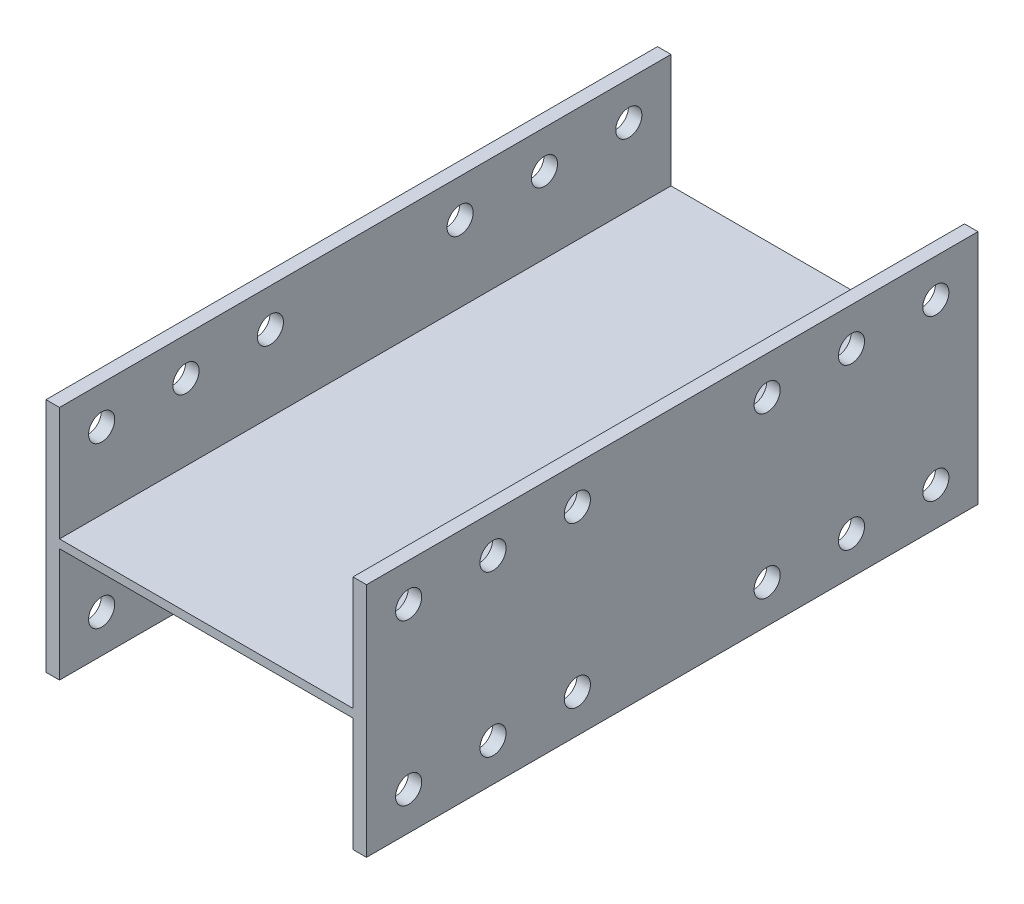
ISO-10303-21;
HEADER;
FILE_DESCRIPTION(('STEP AP214'),'2;1');
FILE_NAME('part.step','',(''),(''),'','','');
FILE_SCHEMA(('AUTOMOTIVE_DESIGN { 1 0 10303 214 1 1 1 1 }'));
ENDSEC;
DATA;
#1=APPLICATION_CONTEXT('core data for automotive mechanical design processes');
#2=APPLICATION_PROTOCOL_DEFINITION('international standard','automotive_design',2000,#1);
#3=PRODUCT_CONTEXT('',#1,'mechanical');
#4=PRODUCT('Part','Part','',(#3));
#5=PRODUCT_RELATED_PRODUCT_CATEGORY('part','',(#4));
#6=PRODUCT_DEFINITION_FORMATION('','',#4);
#7=PRODUCT_DEFINITION_CONTEXT('part definition',#1,'design');
#8=PRODUCT_DEFINITION('design','',#6,#7);
#9=PRODUCT_DEFINITION_SHAPE('','',#8);
#10=(LENGTH_UNIT() NAMED_UNIT(*) SI_UNIT(.MILLI.,.METRE.));
#11=(NAMED_UNIT(*) PLANE_ANGLE_UNIT() SI_UNIT($,.RADIAN.));
#12=(NAMED_UNIT(*) SI_UNIT($,.STERADIAN.) SOLID_ANGLE_UNIT());
#13=UNCERTAINTY_MEASURE_WITH_UNIT(LENGTH_MEASURE(1.E-05),#10,'distance_accuracy_value','');
#14=(GEOMETRIC_REPRESENTATION_CONTEXT(3) GLOBAL_UNCERTAINTY_ASSIGNED_CONTEXT((#13)) GLOBAL_UNIT_ASSIGNED_CONTEXT((#10,
#11,#12)) REPRESENTATION_CONTEXT('',''));
#15=CARTESIAN_POINT('',(0.,0.,0.));
#16=DIRECTION('',(0.,0.,1.));
#17=DIRECTION('',(1.,0.,0.));
#18=AXIS2_PLACEMENT_3D('',#15,#16,#17);
#19=CARTESIAN_POINT('',(174.,-5.,362.5));
#20=DIRECTION('',(0.,1.,0.));
#21=DIRECTION('',(0.,0.,1.));
#22=AXIS2_PLACEMENT_3D('',#19,#20,#21);
#23=PLANE('',#22);
#24=DIRECTION('',(1.,0.,0.));
#25=VECTOR('',#24,1.);
#26=CARTESIAN_POINT('',(174.,-5.,-362.5));
#27=LINE('',#26,#25);
#28=CARTESIAN_POINT('',(-174.,-5.,-362.5));
#29=VERTEX_POINT('',#28);
#30=CARTESIAN_POINT('',(174.,-5.,-362.5));
#31=VERTEX_POINT('',#30);
#32=EDGE_CURVE('E154',#29,#31,#27,.T.);
#33=ORIENTED_EDGE('',*,*,#32,.T.);
#34=DIRECTION('',(0.,0.,-1.));
#35=VECTOR('',#34,1.);
#36=CARTESIAN_POINT('',(174.,-5.,362.5));
#37=LINE('',#36,#35);
#38=CARTESIAN_POINT('',(174.,-5.,362.5));
#39=VERTEX_POINT('',#38);
#40=EDGE_CURVE('E11',#39,#31,#37,.T.);
#41=ORIENTED_EDGE('',*,*,#40,.F.);
#42=DIRECTION('',(1.,0.,0.));
#43=VECTOR('',#42,1.);
#44=CARTESIAN_POINT('',(174.,-5.,362.5));
#45=LINE('',#44,#43);
#46=CARTESIAN_POINT('',(-174.,-5.,362.5));
#47=VERTEX_POINT('',#46);
#48=EDGE_CURVE('E177',#47,#39,#45,.T.);
#49=ORIENTED_EDGE('',*,*,#48,.F.);
#50=DIRECTION('',(0.,0.,-1.));
#51=VECTOR('',#50,1.);
#52=CARTESIAN_POINT('',(-174.,-5.,362.5));
#53=LINE('',#52,#51);
#54=EDGE_CURVE('E150',#47,#29,#53,.T.);
#55=ORIENTED_EDGE('',*,*,#54,.T.);
#56=EDGE_LOOP('',(#33,#41,#49,#55));
#57=FACE_BOUND('',#56,.T.);
#58=ADVANCED_FACE('F32',(#57),#23,.F.);
#59=CARTESIAN_POINT('',(174.,-5.,362.5));
#60=DIRECTION('',(1.,0.,0.));
#61=DIRECTION('',(0.,1.,0.));
#62=AXIS2_PLACEMENT_3D('',#59,#60,#61);
#63=PLANE('',#62);
#64=CARTESIAN_POINT('',(174.,-95.,-112.5));
#65=DIRECTION('',(1.,0.,0.));
#66=DIRECTION('',(0.,1.,0.));
#67=AXIS2_PLACEMENT_3D('',#64,#65,#66);
#68=CIRCLE('',#67,15.5);
#69=CARTESIAN_POINT('',(174.,-79.5,-112.5));
#70=VERTEX_POINT('',#69);
#71=EDGE_CURVE('E235',#70,#70,#68,.T.);
#72=ORIENTED_EDGE('',*,*,#71,.T.);
#73=EDGE_LOOP('',(#72));
#74=FACE_BOUND('',#73,.T.);
#75=CARTESIAN_POINT('',(174.,-95.,-212.5));
#76=DIRECTION('',(1.,0.,0.));
#77=DIRECTION('',(0.,1.,0.));
#78=AXIS2_PLACEMENT_3D('',#75,#76,#77);
#79=CIRCLE('',#78,15.5);
#80=CARTESIAN_POINT('',(174.,-79.5,-212.5));
#81=VERTEX_POINT('',#80);
#82=EDGE_CURVE('E222',#81,#81,#79,.T.);
#83=ORIENTED_EDGE('',*,*,#82,.T.);
#84=EDGE_LOOP('',(#83));
#85=FACE_BOUND('',#84,.T.);
#86=CARTESIAN_POINT('',(174.,-95.,-312.5));
#87=DIRECTION('',(1.,0.,0.));
#88=DIRECTION('',(0.,1.,0.));
#89=AXIS2_PLACEMENT_3D('',#86,#87,#88);
#90=CIRCLE('',#89,15.5);
#91=CARTESIAN_POINT('',(174.,-79.5,-312.5));
#92=VERTEX_POINT('',#91);
#93=EDGE_CURVE('E218',#92,#92,#90,.T.);
#94=ORIENTED_EDGE('',*,*,#93,.T.);
#95=EDGE_LOOP('',(#94));
#96=FACE_BOUND('',#95,.T.);
#97=CARTESIAN_POINT('',(174.,-95.,312.5));
#98=DIRECTION('',(1.,0.,0.));
#99=DIRECTION('',(0.,1.,0.));
#100=AXIS2_PLACEMENT_3D('',#97,#98,#99);
#101=CIRCLE('',#100,15.5);
#102=CARTESIAN_POINT('',(174.,-79.5,312.5));
#103=VERTEX_POINT('',#102);
#104=EDGE_CURVE('E214',#103,#103,#101,.T.);
#105=ORIENTED_EDGE('',*,*,#104,.T.);
#106=EDGE_LOOP('',(#105));
#107=FACE_BOUND('',#106,.T.);
#108=CARTESIAN_POINT('',(174.,-95.,212.5));
#109=DIRECTION('',(1.,0.,0.));
#110=DIRECTION('',(0.,1.,0.));
#111=AXIS2_PLACEMENT_3D('',#108,#109,#110);
#112=CIRCLE('',#111,15.5);
#113=CARTESIAN_POINT('',(174.,-79.5,212.5));
#114=VERTEX_POINT('',#113);
#115=EDGE_CURVE('E209',#114,#114,#112,.T.);
#116=ORIENTED_EDGE('',*,*,#115,.T.);
#117=EDGE_LOOP('',(#116));
#118=FACE_BOUND('',#117,.T.);
#119=CARTESIAN_POINT('',(174.,-95.,112.5));
#120=DIRECTION('',(1.,0.,0.));
#121=DIRECTION('',(0.,1.,0.));
#122=AXIS2_PLACEMENT_3D('',#119,#120,#121);
#123=CIRCLE('',#122,15.5);
#124=CARTESIAN_POINT('',(174.,-79.5,112.5));
#125=VERTEX_POINT('',#124);
#126=EDGE_CURVE('E204',#125,#125,#123,.T.);
#127=ORIENTED_EDGE('',*,*,#126,.T.);
#128=EDGE_LOOP('',(#127));
#129=FACE_BOUND('',#128,.T.);
#130=DIRECTION('',(0.,-1.,0.));
#131=VECTOR('',#130,1.);
#132=CARTESIAN_POINT('',(174.,-5.,-362.5));
#133=LINE('',#132,#131);
#134=CARTESIAN_POINT('',(174.,-140.,-362.5));
#135=VERTEX_POINT('',#134);
#136=EDGE_CURVE('E157',#31,#135,#133,.T.);
#137=ORIENTED_EDGE('',*,*,#136,.T.);
#138=DIRECTION('',(0.,0.,-1.));
#139=VECTOR('',#138,1.);
#140=CARTESIAN_POINT('',(174.,-140.,362.5));
#141=LINE('',#140,#139);
#142=CARTESIAN_POINT('',(174.,-140.,362.5));
#143=VERTEX_POINT('',#142);
#144=EDGE_CURVE('E41',#143,#135,#141,.T.);
#145=ORIENTED_EDGE('',*,*,#144,.F.);
#146=DIRECTION('',(0.,-1.,0.));
#147=VECTOR('',#146,1.);
#148=CARTESIAN_POINT('',(174.,-5.,362.5));
#149=LINE('',#148,#147);
#150=EDGE_CURVE('E105',#39,#143,#149,.T.);
#151=ORIENTED_EDGE('',*,*,#150,.F.);
#152=ORIENTED_EDGE('',*,*,#40,.T.);
#153=EDGE_LOOP('',(#137,#145,#151,#152));
#154=FACE_BOUND('',#153,.T.);
#155=ADVANCED_FACE('F344',(#74,#85,#96,#107,#118,#129,#154),#63,.F.);
#156=CARTESIAN_POINT('',(174.,-140.,362.5));
#157=DIRECTION('',(0.,1.,0.));
#158=DIRECTION('',(0.,0.,1.));
#159=AXIS2_PLACEMENT_3D('',#156,#157,#158);
#160=PLANE('',#159);
#161=DIRECTION('',(1.,0.,0.));
#162=VECTOR('',#161,1.);
#163=CARTESIAN_POINT('',(174.,-140.,-362.5));
#164=LINE('',#163,#162);
#165=CARTESIAN_POINT('',(190.,-140.,-362.5));
#166=VERTEX_POINT('',#165);
#167=EDGE_CURVE('E160',#135,#166,#164,.T.);
#168=ORIENTED_EDGE('',*,*,#167,.T.);
#169=DIRECTION('',(0.,0.,-1.));
#170=VECTOR('',#169,1.);
#171=CARTESIAN_POINT('',(190.,-140.,362.5));
#172=LINE('',#171,#170);
#173=CARTESIAN_POINT('',(190.,-140.,362.5));
#174=VERTEX_POINT('',#173);
#175=EDGE_CURVE('E196',#174,#166,#172,.T.);
#176=ORIENTED_EDGE('',*,*,#175,.F.);
#177=DIRECTION('',(1.,0.,0.));
#178=VECTOR('',#177,1.);
#179=CARTESIAN_POINT('',(174.,-140.,362.5));
#180=LINE('',#179,#178);
#181=EDGE_CURVE('E303',#143,#174,#180,.T.);
#182=ORIENTED_EDGE('',*,*,#181,.F.);
#183=ORIENTED_EDGE('',*,*,#144,.T.);
#184=EDGE_LOOP('',(#168,#176,#182,#183));
#185=FACE_BOUND('',#184,.T.);
#186=ADVANCED_FACE('F348',(#185),#160,.F.);
#187=CARTESIAN_POINT('',(190.,-140.,362.5));
#188=DIRECTION('',(-1.,0.,0.));
#189=DIRECTION('',(0.,-1.,0.));
#190=AXIS2_PLACEMENT_3D('',#187,#188,#189);
#191=PLANE('',#190);
#192=CARTESIAN_POINT('',(190.,95.,-312.5));
#193=DIRECTION('',(1.,0.,0.));
#194=DIRECTION('',(0.,0.,1.));
#195=AXIS2_PLACEMENT_3D('',#192,#193,#194);
#196=CIRCLE('',#195,15.5);
#197=CARTESIAN_POINT('',(190.,95.,-297.));
#198=VERTEX_POINT('',#197);
#199=EDGE_CURVE('E487',#198,#198,#196,.T.);
#200=ORIENTED_EDGE('',*,*,#199,.F.);
#201=EDGE_LOOP('',(#200));
#202=FACE_BOUND('',#201,.T.);
#203=CARTESIAN_POINT('',(190.,95.,-212.5));
#204=DIRECTION('',(1.,0.,0.));
#205=DIRECTION('',(0.,0.,1.));
#206=AXIS2_PLACEMENT_3D('',#203,#204,#205);
#207=CIRCLE('',#206,15.5);
#208=CARTESIAN_POINT('',(190.,95.,-197.));
#209=VERTEX_POINT('',#208);
#210=EDGE_CURVE('E491',#209,#209,#207,.T.);
#211=ORIENTED_EDGE('',*,*,#210,.F.);
#212=EDGE_LOOP('',(#211));
#213=FACE_BOUND('',#212,.T.);
#214=CARTESIAN_POINT('',(190.,95.,-112.5));
#215=DIRECTION('',(1.,0.,0.));
#216=DIRECTION('',(0.,0.,1.));
#217=AXIS2_PLACEMENT_3D('',#214,#215,#216);
#218=CIRCLE('',#217,15.5);
#219=CARTESIAN_POINT('',(190.,95.,-97.));
#220=VERTEX_POINT('',#219);
#221=EDGE_CURVE('E507',#220,#220,#218,.T.);
#222=ORIENTED_EDGE('',*,*,#221,.F.);
#223=EDGE_LOOP('',(#222));
#224=FACE_BOUND('',#223,.T.);
#225=CARTESIAN_POINT('',(190.,-95.,-112.5));
#226=DIRECTION('',(1.,0.,0.));
#227=DIRECTION('',(0.,0.,-1.));
#228=AXIS2_PLACEMENT_3D('',#225,#226,#227);
#229=CIRCLE('',#228,15.5);
#230=CARTESIAN_POINT('',(190.,-95.,-128.));
#231=VERTEX_POINT('',#230);
#232=EDGE_CURVE('E517',#231,#231,#229,.T.);
#233=ORIENTED_EDGE('',*,*,#232,.F.);
#234=EDGE_LOOP('',(#233));
#235=FACE_BOUND('',#234,.T.);
#236=CARTESIAN_POINT('',(190.,-95.,-212.5));
#237=DIRECTION('',(1.,0.,0.));
#238=DIRECTION('',(0.,0.,-1.));
#239=AXIS2_PLACEMENT_3D('',#236,#237,#238);
#240=CIRCLE('',#239,15.5);
#241=CARTESIAN_POINT('',(190.,-95.,-228.));
#242=VERTEX_POINT('',#241);
#243=EDGE_CURVE('E230',#242,#242,#240,.T.);
#244=ORIENTED_EDGE('',*,*,#243,.F.);
#245=EDGE_LOOP('',(#244));
#246=FACE_BOUND('',#245,.T.);
#247=CARTESIAN_POINT('',(190.,-95.,-312.5));
#248=DIRECTION('',(1.,0.,0.));
#249=DIRECTION('',(0.,0.,-1.));
#250=AXIS2_PLACEMENT_3D('',#247,#248,#249);
#251=CIRCLE('',#250,15.5);
#252=CARTESIAN_POINT('',(190.,-95.,-328.));
#253=VERTEX_POINT('',#252);
#254=EDGE_CURVE('E227',#253,#253,#251,.T.);
#255=ORIENTED_EDGE('',*,*,#254,.F.);
#256=EDGE_LOOP('',(#255));
#257=FACE_BOUND('',#256,.T.);
#258=CARTESIAN_POINT('',(190.,-95.,312.5));
#259=DIRECTION('',(1.,0.,0.));
#260=DIRECTION('',(0.,0.,1.));
#261=AXIS2_PLACEMENT_3D('',#258,#259,#260);
#262=CIRCLE('',#261,15.5);
#263=CARTESIAN_POINT('',(190.,-95.,328.));
#264=VERTEX_POINT('',#263);
#265=EDGE_CURVE('E245',#264,#264,#262,.T.);
#266=ORIENTED_EDGE('',*,*,#265,.F.);
#267=EDGE_LOOP('',(#266));
#268=FACE_BOUND('',#267,.T.);
#269=CARTESIAN_POINT('',(190.,-95.,212.5));
#270=DIRECTION('',(1.,0.,0.));
#271=DIRECTION('',(0.,0.,1.));
#272=AXIS2_PLACEMENT_3D('',#269,#270,#271);
#273=CIRCLE('',#272,15.5);
#274=CARTESIAN_POINT('',(190.,-95.,228.));
#275=VERTEX_POINT('',#274);
#276=EDGE_CURVE('E252',#275,#275,#273,.T.);
#277=ORIENTED_EDGE('',*,*,#276,.F.);
#278=EDGE_LOOP('',(#277));
#279=FACE_BOUND('',#278,.T.);
#280=CARTESIAN_POINT('',(190.,95.,112.5));
#281=DIRECTION('',(1.,0.,0.));
#282=DIRECTION('',(0.,0.,-1.));
#283=AXIS2_PLACEMENT_3D('',#280,#281,#282);
#284=CIRCLE('',#283,15.5);
#285=CARTESIAN_POINT('',(190.,95.,97.));
#286=VERTEX_POINT('',#285);
#287=EDGE_CURVE('E259',#286,#286,#284,.T.);
#288=ORIENTED_EDGE('',*,*,#287,.F.);
#289=EDGE_LOOP('',(#288));
#290=FACE_BOUND('',#289,.T.);
#291=CARTESIAN_POINT('',(190.,95.,212.5));
#292=DIRECTION('',(1.,0.,0.));
#293=DIRECTION('',(0.,0.,-1.));
#294=AXIS2_PLACEMENT_3D('',#291,#292,#293);
#295=CIRCLE('',#294,15.5);
#296=CARTESIAN_POINT('',(190.,95.,197.));
#297=VERTEX_POINT('',#296);
#298=EDGE_CURVE('E271',#297,#297,#295,.T.);
#299=ORIENTED_EDGE('',*,*,#298,.F.);
#300=EDGE_LOOP('',(#299));
#301=FACE_BOUND('',#300,.T.);
#302=CARTESIAN_POINT('',(190.,-95.,112.5));
#303=DIRECTION('',(1.,0.,0.));
#304=DIRECTION('',(0.,0.,1.));
#305=AXIS2_PLACEMENT_3D('',#302,#303,#304);
#306=CIRCLE('',#305,15.5);
#307=CARTESIAN_POINT('',(190.,-95.,128.));
#308=VERTEX_POINT('',#307);
#309=EDGE_CURVE('E283',#308,#308,#306,.T.);
#310=ORIENTED_EDGE('',*,*,#309,.F.);
#311=EDGE_LOOP('',(#310));
#312=FACE_BOUND('',#311,.T.);
#313=CARTESIAN_POINT('',(190.,95.,312.5));
#314=DIRECTION('',(1.,0.,0.));
#315=DIRECTION('',(0.,0.,-1.));
#316=AXIS2_PLACEMENT_3D('',#313,#314,#315);
#317=CIRCLE('',#316,15.5);
#318=CARTESIAN_POINT('',(190.,95.,297.));
#319=VERTEX_POINT('',#318);
#320=EDGE_CURVE('E290',#319,#319,#317,.T.);
#321=ORIENTED_EDGE('',*,*,#320,.F.);
#322=EDGE_LOOP('',(#321));
#323=FACE_BOUND('',#322,.T.);
#324=DIRECTION('',(0.,1.,0.));
#325=VECTOR('',#324,1.);
#326=CARTESIAN_POINT('',(190.,-140.,-362.5));
#327=LINE('',#326,#325);
#328=CARTESIAN_POINT('',(190.,140.,-362.5));
#329=VERTEX_POINT('',#328);
#330=EDGE_CURVE('E162',#166,#329,#327,.T.);
#331=ORIENTED_EDGE('',*,*,#330,.T.);
#332=DIRECTION('',(0.,0.,-1.));
#333=VECTOR('',#332,1.);
#334=CARTESIAN_POINT('',(190.,140.,362.5));
#335=LINE('',#334,#333);
#336=CARTESIAN_POINT('',(190.,140.,362.5));
#337=VERTEX_POINT('',#336);
#338=EDGE_CURVE('E193',#337,#329,#335,.T.);
#339=ORIENTED_EDGE('',*,*,#338,.F.);
#340=DIRECTION('',(0.,1.,0.));
#341=VECTOR('',#340,1.);
#342=CARTESIAN_POINT('',(190.,-140.,362.5));
#343=LINE('',#342,#341);
#344=EDGE_CURVE('E305',#174,#337,#343,.T.);
#345=ORIENTED_EDGE('',*,*,#344,.F.);
#346=ORIENTED_EDGE('',*,*,#175,.T.);
#347=EDGE_LOOP('',(#331,#339,#345,#346));
#348=FACE_BOUND('',#347,.T.);
#349=ADVANCED_FACE('F353',(#202,#213,#224,#235,#246,#257,#268,#279,#290,#301,#312,#323,#348),
#191,.F.);
#350=CARTESIAN_POINT('',(190.,140.,362.5));
#351=DIRECTION('',(0.,-1.,0.));
#352=DIRECTION('',(1.,0.,0.));
#353=AXIS2_PLACEMENT_3D('',#350,#351,#352);
#354=PLANE('',#353);
#355=DIRECTION('',(-1.,0.,0.));
#356=VECTOR('',#355,1.);
#357=CARTESIAN_POINT('',(190.,140.,-362.5));
#358=LINE('',#357,#356);
#359=CARTESIAN_POINT('',(174.,140.,-362.5));
#360=VERTEX_POINT('',#359);
#361=EDGE_CURVE('E164',#329,#360,#358,.T.);
#362=ORIENTED_EDGE('',*,*,#361,.T.);
#363=DIRECTION('',(0.,0.,-1.));
#364=VECTOR('',#363,1.);
#365=CARTESIAN_POINT('',(174.,140.,362.5));
#366=LINE('',#365,#364);
#367=CARTESIAN_POINT('',(174.,140.,362.5));
#368=VERTEX_POINT('',#367);
#369=EDGE_CURVE('E190',#368,#360,#366,.T.);
#370=ORIENTED_EDGE('',*,*,#369,.F.);
#371=DIRECTION('',(-1.,0.,0.));
#372=VECTOR('',#371,1.);
#373=CARTESIAN_POINT('',(190.,140.,362.5));
#374=LINE('',#373,#372);
#375=EDGE_CURVE('E307',#337,#368,#374,.T.);
#376=ORIENTED_EDGE('',*,*,#375,.F.);
#377=ORIENTED_EDGE('',*,*,#338,.T.);
#378=EDGE_LOOP('',(#362,#370,#376,#377));
#379=FACE_BOUND('',#378,.T.);
#380=ADVANCED_FACE('F361',(#379),#354,.F.);
#381=CARTESIAN_POINT('',(174.,140.,362.5));
#382=DIRECTION('',(1.,0.,0.));
#383=DIRECTION('',(0.,1.,0.));
#384=AXIS2_PLACEMENT_3D('',#381,#382,#383);
#385=PLANE('',#384);
#386=CARTESIAN_POINT('',(174.,95.,-312.5));
#387=DIRECTION('',(1.,0.,0.));
#388=DIRECTION('',(0.,1.,0.));
#389=AXIS2_PLACEMENT_3D('',#386,#387,#388);
#390=CIRCLE('',#389,15.5);
#391=CARTESIAN_POINT('',(174.,110.5,-312.5));
#392=VERTEX_POINT('',#391);
#393=EDGE_CURVE('E490',#392,#392,#390,.T.);
#394=ORIENTED_EDGE('',*,*,#393,.T.);
#395=EDGE_LOOP('',(#394));
#396=FACE_BOUND('',#395,.T.);
#397=CARTESIAN_POINT('',(174.,95.,-212.5));
#398=DIRECTION('',(1.,0.,0.));
#399=DIRECTION('',(0.,1.,0.));
#400=AXIS2_PLACEMENT_3D('',#397,#398,#399);
#401=CIRCLE('',#400,15.5);
#402=CARTESIAN_POINT('',(174.,110.5,-212.5));
#403=VERTEX_POINT('',#402);
#404=EDGE_CURVE('E504',#403,#403,#401,.T.);
#405=ORIENTED_EDGE('',*,*,#404,.T.);
#406=EDGE_LOOP('',(#405));
#407=FACE_BOUND('',#406,.T.);
#408=CARTESIAN_POINT('',(174.,95.,-112.5));
#409=DIRECTION('',(1.,0.,0.));
#410=DIRECTION('',(0.,1.,0.));
#411=AXIS2_PLACEMENT_3D('',#408,#409,#410);
#412=CIRCLE('',#411,15.5);
#413=CARTESIAN_POINT('',(174.,110.5,-112.5));
#414=VERTEX_POINT('',#413);
#415=EDGE_CURVE('E514',#414,#414,#412,.T.);
#416=ORIENTED_EDGE('',*,*,#415,.T.);
#417=EDGE_LOOP('',(#416));
#418=FACE_BOUND('',#417,.T.);
#419=CARTESIAN_POINT('',(174.,95.,112.5));
#420=DIRECTION('',(1.,0.,0.));
#421=DIRECTION('',(0.,1.,0.));
#422=AXIS2_PLACEMENT_3D('',#419,#420,#421);
#423=CIRCLE('',#422,15.5);
#424=CARTESIAN_POINT('',(174.,110.5,112.5));
#425=VERTEX_POINT('',#424);
#426=EDGE_CURVE('E268',#425,#425,#423,.T.);
#427=ORIENTED_EDGE('',*,*,#426,.T.);
#428=EDGE_LOOP('',(#427));
#429=FACE_BOUND('',#428,.T.);
#430=CARTESIAN_POINT('',(174.,95.,212.5));
#431=DIRECTION('',(1.,0.,0.));
#432=DIRECTION('',(0.,1.,0.));
#433=AXIS2_PLACEMENT_3D('',#430,#431,#432);
#434=CIRCLE('',#433,15.5);
#435=CARTESIAN_POINT('',(174.,110.5,212.5));
#436=VERTEX_POINT('',#435);
#437=EDGE_CURVE('E280',#436,#436,#434,.T.);
#438=ORIENTED_EDGE('',*,*,#437,.T.);
#439=EDGE_LOOP('',(#438));
#440=FACE_BOUND('',#439,.T.);
#441=CARTESIAN_POINT('',(174.,95.,312.5));
#442=DIRECTION('',(1.,0.,0.));
#443=DIRECTION('',(0.,1.,0.));
#444=AXIS2_PLACEMENT_3D('',#441,#442,#443);
#445=CIRCLE('',#444,15.5);
#446=CARTESIAN_POINT('',(174.,110.5,312.5));
#447=VERTEX_POINT('',#446);
#448=EDGE_CURVE('E158',#447,#447,#445,.T.);
#449=ORIENTED_EDGE('',*,*,#448,.T.);
#450=EDGE_LOOP('',(#449));
#451=FACE_BOUND('',#450,.T.);
#452=DIRECTION('',(0.,-1.,0.));
#453=VECTOR('',#452,1.);
#454=CARTESIAN_POINT('',(174.,140.,-362.5));
#455=LINE('',#454,#453);
#456=CARTESIAN_POINT('',(174.,5.,-362.5));
#457=VERTEX_POINT('',#456);
#458=EDGE_CURVE('E166',#360,#457,#455,.T.);
#459=ORIENTED_EDGE('',*,*,#458,.T.);
#460=DIRECTION('',(0.,0.,-1.));
#461=VECTOR('',#460,1.);
#462=CARTESIAN_POINT('',(174.,5.,362.5));
#463=LINE('',#462,#461);
#464=CARTESIAN_POINT('',(174.,5.,362.5));
#465=VERTEX_POINT('',#464);
#466=EDGE_CURVE('E187',#465,#457,#463,.T.);
#467=ORIENTED_EDGE('',*,*,#466,.F.);
#468=DIRECTION('',(0.,-1.,0.));
#469=VECTOR('',#468,1.);
#470=CARTESIAN_POINT('',(174.,140.,362.5));
#471=LINE('',#470,#469);
#472=EDGE_CURVE('E309',#368,#465,#471,.T.);
#473=ORIENTED_EDGE('',*,*,#472,.F.);
#474=ORIENTED_EDGE('',*,*,#369,.T.);
#475=EDGE_LOOP('',(#459,#467,#473,#474));
#476=FACE_BOUND('',#475,.T.);
#477=ADVANCED_FACE('F365',(#396,#407,#418,#429,#440,#451,#476),#385,.F.);
#478=CARTESIAN_POINT('',(-174.,5.,362.5));
#479=DIRECTION('',(0.,-1.,0.));
#480=DIRECTION('',(0.,0.,-1.));
#481=AXIS2_PLACEMENT_3D('',#478,#479,#480);
#482=PLANE('',#481);
#483=DIRECTION('',(-1.,0.,0.));
#484=VECTOR('',#483,1.);
#485=CARTESIAN_POINT('',(-174.,5.,-362.5));
#486=LINE('',#485,#484);
#487=CARTESIAN_POINT('',(-174.,5.,-362.5));
#488=VERTEX_POINT('',#487);
#489=EDGE_CURVE('E168',#457,#488,#486,.T.);
#490=ORIENTED_EDGE('',*,*,#489,.T.);
#491=DIRECTION('',(0.,0.,-1.));
#492=VECTOR('',#491,1.);
#493=CARTESIAN_POINT('',(-174.,5.,362.5));
#494=LINE('',#493,#492);
#495=CARTESIAN_POINT('',(-174.,5.,362.5));
#496=VERTEX_POINT('',#495);
#497=EDGE_CURVE('E184',#496,#488,#494,.T.);
#498=ORIENTED_EDGE('',*,*,#497,.F.);
#499=DIRECTION('',(-1.,0.,0.));
#500=VECTOR('',#499,1.);
#501=CARTESIAN_POINT('',(-174.,5.,362.5));
#502=LINE('',#501,#500);
#503=EDGE_CURVE('E311',#465,#496,#502,.T.);
#504=ORIENTED_EDGE('',*,*,#503,.F.);
#505=ORIENTED_EDGE('',*,*,#466,.T.);
#506=EDGE_LOOP('',(#490,#498,#504,#505));
#507=FACE_BOUND('',#506,.T.);
#508=ADVANCED_FACE('F369',(#507),#482,.F.);
#509=CARTESIAN_POINT('',(-174.,5.,362.5));
#510=DIRECTION('',(-1.,0.,0.));
#511=DIRECTION('',(0.,0.,1.));
#512=AXIS2_PLACEMENT_3D('',#509,#510,#511);
#513=PLANE('',#512);
#514=CARTESIAN_POINT('',(-174.,95.,-312.5));
#515=DIRECTION('',(-1.,0.,0.));
#516=DIRECTION('',(0.,0.,1.));
#517=AXIS2_PLACEMENT_3D('',#514,#515,#516);
#518=CIRCLE('',#517,15.5);
#519=CARTESIAN_POINT('',(-174.,95.,-297.));
#520=VERTEX_POINT('',#519);
#521=EDGE_CURVE('E492',#520,#520,#518,.T.);
#522=ORIENTED_EDGE('',*,*,#521,.T.);
#523=EDGE_LOOP('',(#522));
#524=FACE_BOUND('',#523,.T.);
#525=CARTESIAN_POINT('',(-174.,95.,-212.5));
#526=DIRECTION('',(-1.,0.,0.));
#527=DIRECTION('',(0.,0.,1.));
#528=AXIS2_PLACEMENT_3D('',#525,#526,#527);
#529=CIRCLE('',#528,15.5);
#530=CARTESIAN_POINT('',(-174.,95.,-197.));
#531=VERTEX_POINT('',#530);
#532=EDGE_CURVE('E501',#531,#531,#529,.T.);
#533=ORIENTED_EDGE('',*,*,#532,.T.);
#534=EDGE_LOOP('',(#533));
#535=FACE_BOUND('',#534,.T.);
#536=CARTESIAN_POINT('',(-174.,95.,-112.5));
#537=DIRECTION('',(-1.,0.,0.));
#538=DIRECTION('',(0.,0.,1.));
#539=AXIS2_PLACEMENT_3D('',#536,#537,#538);
#540=CIRCLE('',#539,15.5);
#541=CARTESIAN_POINT('',(-174.,95.,-97.));
#542=VERTEX_POINT('',#541);
#543=EDGE_CURVE('E511',#542,#542,#540,.T.);
#544=ORIENTED_EDGE('',*,*,#543,.T.);
#545=EDGE_LOOP('',(#544));
#546=FACE_BOUND('',#545,.T.);
#547=CARTESIAN_POINT('',(-174.,95.,112.5));
#548=DIRECTION('',(-1.,0.,0.));
#549=DIRECTION('',(0.,0.,1.));
#550=AXIS2_PLACEMENT_3D('',#547,#548,#549);
#551=CIRCLE('',#550,15.5);
#552=CARTESIAN_POINT('',(-174.,95.,128.));
#553=VERTEX_POINT('',#552);
#554=EDGE_CURVE('E265',#553,#553,#551,.T.);
#555=ORIENTED_EDGE('',*,*,#554,.T.);
#556=EDGE_LOOP('',(#555));
#557=FACE_BOUND('',#556,.T.);
#558=CARTESIAN_POINT('',(-174.,95.,212.5));
#559=DIRECTION('',(-1.,0.,0.));
#560=DIRECTION('',(0.,0.,1.));
#561=AXIS2_PLACEMENT_3D('',#558,#559,#560);
#562=CIRCLE('',#561,15.5);
#563=CARTESIAN_POINT('',(-174.,95.,228.));
#564=VERTEX_POINT('',#563);
#565=EDGE_CURVE('E277',#564,#564,#562,.T.);
#566=ORIENTED_EDGE('',*,*,#565,.T.);
#567=EDGE_LOOP('',(#566));
#568=FACE_BOUND('',#567,.T.);
#569=CARTESIAN_POINT('',(-174.,95.,312.5));
#570=DIRECTION('',(-1.,0.,0.));
#571=DIRECTION('',(0.,0.,1.));
#572=AXIS2_PLACEMENT_3D('',#569,#570,#571);
#573=CIRCLE('',#572,15.5);
#574=CARTESIAN_POINT('',(-174.,95.,328.));
#575=VERTEX_POINT('',#574);
#576=EDGE_CURVE('E296',#575,#575,#573,.T.);
#577=ORIENTED_EDGE('',*,*,#576,.T.);
#578=EDGE_LOOP('',(#577));
#579=FACE_BOUND('',#578,.T.);
#580=DIRECTION('',(0.,1.,0.));
#581=VECTOR('',#580,1.);
#582=CARTESIAN_POINT('',(-174.,5.,-362.5));
#583=LINE('',#582,#581);
#584=CARTESIAN_POINT('',(-174.,140.,-362.5));
#585=VERTEX_POINT('',#584);
#586=EDGE_CURVE('E170',#488,#585,#583,.T.);
#587=ORIENTED_EDGE('',*,*,#586,.T.);
#588=DIRECTION('',(0.,0.,-1.));
#589=VECTOR('',#588,1.);
#590=CARTESIAN_POINT('',(-174.,140.,362.5));
#591=LINE('',#590,#589);
#592=CARTESIAN_POINT('',(-174.,140.,362.5));
#593=VERTEX_POINT('',#592);
#594=EDGE_CURVE('E181',#593,#585,#591,.T.);
#595=ORIENTED_EDGE('',*,*,#594,.F.);
#596=DIRECTION('',(0.,1.,0.));
#597=VECTOR('',#596,1.);
#598=CARTESIAN_POINT('',(-174.,5.,362.5));
#599=LINE('',#598,#597);
#600=EDGE_CURVE('E313',#496,#593,#599,.T.);
#601=ORIENTED_EDGE('',*,*,#600,.F.);
#602=ORIENTED_EDGE('',*,*,#497,.T.);
#603=EDGE_LOOP('',(#587,#595,#601,#602));
#604=FACE_BOUND('',#603,.T.);
#605=ADVANCED_FACE('F319',(#524,#535,#546,#557,#568,#579,#604),#513,.F.);
#606=CARTESIAN_POINT('',(-174.,140.,362.5));
#607=DIRECTION('',(0.,-1.,0.));
#608=DIRECTION('',(1.,0.,0.));
#609=AXIS2_PLACEMENT_3D('',#606,#607,#608);
#610=PLANE('',#609);
#611=DIRECTION('',(-1.,0.,0.));
#612=VECTOR('',#611,1.);
#613=CARTESIAN_POINT('',(-174.,140.,-362.5));
#614=LINE('',#613,#612);
#615=CARTESIAN_POINT('',(-190.,140.,-362.5));
#616=VERTEX_POINT('',#615);
#617=EDGE_CURVE('E172',#585,#616,#614,.T.);
#618=ORIENTED_EDGE('',*,*,#617,.T.);
#619=DIRECTION('',(0.,0.,-1.));
#620=VECTOR('',#619,1.);
#621=CARTESIAN_POINT('',(-190.,140.,362.5));
#622=LINE('',#621,#620);
#623=CARTESIAN_POINT('',(-190.,140.,362.5));
#624=VERTEX_POINT('',#623);
#625=EDGE_CURVE('E145',#624,#616,#622,.T.);
#626=ORIENTED_EDGE('',*,*,#625,.F.);
#627=DIRECTION('',(-1.,0.,0.));
#628=VECTOR('',#627,1.);
#629=CARTESIAN_POINT('',(-174.,140.,362.5));
#630=LINE('',#629,#628);
#631=EDGE_CURVE('E136',#593,#624,#630,.T.);
#632=ORIENTED_EDGE('',*,*,#631,.F.);
#633=ORIENTED_EDGE('',*,*,#594,.T.);
#634=EDGE_LOOP('',(#618,#626,#632,#633));
#635=FACE_BOUND('',#634,.T.);
#636=ADVANCED_FACE('F323',(#635),#610,.F.);
#637=CARTESIAN_POINT('',(-190.,140.,362.5));
#638=DIRECTION('',(1.,0.,0.));
#639=DIRECTION('',(0.,1.,0.));
#640=AXIS2_PLACEMENT_3D('',#637,#638,#639);
#641=PLANE('',#640);
#642=CARTESIAN_POINT('',(-190.,95.,-312.5));
#643=DIRECTION('',(1.,0.,0.));
#644=DIRECTION('',(0.,0.,1.));
#645=AXIS2_PLACEMENT_3D('',#642,#643,#644);
#646=CIRCLE('',#645,15.5);
#647=CARTESIAN_POINT('',(-190.,95.,-297.));
#648=VERTEX_POINT('',#647);
#649=EDGE_CURVE('E386',#648,#648,#646,.T.);
#650=ORIENTED_EDGE('',*,*,#649,.T.);
#651=EDGE_LOOP('',(#650));
#652=FACE_BOUND('',#651,.T.);
#653=CARTESIAN_POINT('',(-190.,95.,-212.5));
#654=DIRECTION('',(1.,0.,0.));
#655=DIRECTION('',(0.,0.,1.));
#656=AXIS2_PLACEMENT_3D('',#653,#654,#655);
#657=CIRCLE('',#656,15.5);
#658=CARTESIAN_POINT('',(-190.,95.,-197.));
#659=VERTEX_POINT('',#658);
#660=EDGE_CURVE('E390',#659,#659,#657,.T.);
#661=ORIENTED_EDGE('',*,*,#660,.T.);
#662=EDGE_LOOP('',(#661));
#663=FACE_BOUND('',#662,.T.);
#664=CARTESIAN_POINT('',(-190.,95.,-112.5));
#665=DIRECTION('',(1.,0.,0.));
#666=DIRECTION('',(0.,0.,1.));
#667=AXIS2_PLACEMENT_3D('',#664,#665,#666);
#668=CIRCLE('',#667,15.5);
#669=CARTESIAN_POINT('',(-190.,95.,-97.));
#670=VERTEX_POINT('',#669);
#671=EDGE_CURVE('E394',#670,#670,#668,.T.);
#672=ORIENTED_EDGE('',*,*,#671,.T.);
#673=EDGE_LOOP('',(#672));
#674=FACE_BOUND('',#673,.T.);
#675=CARTESIAN_POINT('',(-190.,-95.,-112.5));
#676=DIRECTION('',(1.,0.,0.));
#677=DIRECTION('',(0.,0.,-1.));
#678=AXIS2_PLACEMENT_3D('',#675,#676,#677);
#679=CIRCLE('',#678,15.5);
#680=CARTESIAN_POINT('',(-190.,-95.,-128.));
#681=VERTEX_POINT('',#680);
#682=EDGE_CURVE('E397',#681,#681,#679,.T.);
#683=ORIENTED_EDGE('',*,*,#682,.T.);
#684=EDGE_LOOP('',(#683));
#685=FACE_BOUND('',#684,.T.);
#686=CARTESIAN_POINT('',(-190.,-95.,-212.5));
#687=DIRECTION('',(1.,0.,0.));
#688=DIRECTION('',(0.,0.,-1.));
#689=AXIS2_PLACEMENT_3D('',#686,#687,#688);
#690=CIRCLE('',#689,15.5);
#691=CARTESIAN_POINT('',(-190.,-95.,-228.));
#692=VERTEX_POINT('',#691);
#693=EDGE_CURVE('E223',#692,#692,#690,.T.);
#694=ORIENTED_EDGE('',*,*,#693,.T.);
#695=EDGE_LOOP('',(#694));
#696=FACE_BOUND('',#695,.T.);
#697=CARTESIAN_POINT('',(-190.,-95.,-312.5));
#698=DIRECTION('',(1.,0.,0.));
#699=DIRECTION('',(0.,0.,-1.));
#700=AXIS2_PLACEMENT_3D('',#697,#698,#699);
#701=CIRCLE('',#700,15.5);
#702=CARTESIAN_POINT('',(-190.,-95.,-328.));
#703=VERTEX_POINT('',#702);
#704=EDGE_CURVE('E219',#703,#703,#701,.T.);
#705=ORIENTED_EDGE('',*,*,#704,.T.);
#706=EDGE_LOOP('',(#705));
#707=FACE_BOUND('',#706,.T.);
#708=CARTESIAN_POINT('',(-190.,-95.,312.5));
#709=DIRECTION('',(1.,0.,0.));
#710=DIRECTION('',(0.,0.,1.));
#711=AXIS2_PLACEMENT_3D('',#708,#709,#710);
#712=CIRCLE('',#711,15.5);
#713=CARTESIAN_POINT('',(-190.,-95.,328.));
#714=VERTEX_POINT('',#713);
#715=EDGE_CURVE('E215',#714,#714,#712,.T.);
#716=ORIENTED_EDGE('',*,*,#715,.T.);
#717=EDGE_LOOP('',(#716));
#718=FACE_BOUND('',#717,.T.);
#719=CARTESIAN_POINT('',(-190.,-95.,212.5));
#720=DIRECTION('',(1.,0.,0.));
#721=DIRECTION('',(0.,0.,1.));
#722=AXIS2_PLACEMENT_3D('',#719,#720,#721);
#723=CIRCLE('',#722,15.5);
#724=CARTESIAN_POINT('',(-190.,-95.,228.));
#725=VERTEX_POINT('',#724);
#726=EDGE_CURVE('E210',#725,#725,#723,.T.);
#727=ORIENTED_EDGE('',*,*,#726,.T.);
#728=EDGE_LOOP('',(#727));
#729=FACE_BOUND('',#728,.T.);
#730=CARTESIAN_POINT('',(-190.,95.,112.5));
#731=DIRECTION('',(1.,0.,0.));
#732=DIRECTION('',(0.,0.,-1.));
#733=AXIS2_PLACEMENT_3D('',#730,#731,#732);
#734=CIRCLE('',#733,15.5);
#735=CARTESIAN_POINT('',(-190.,95.,97.));
#736=VERTEX_POINT('',#735);
#737=EDGE_CURVE('E262',#736,#736,#734,.T.);
#738=ORIENTED_EDGE('',*,*,#737,.T.);
#739=EDGE_LOOP('',(#738));
#740=FACE_BOUND('',#739,.T.);
#741=CARTESIAN_POINT('',(-190.,95.,212.5));
#742=DIRECTION('',(1.,0.,0.));
#743=DIRECTION('',(0.,0.,-1.));
#744=AXIS2_PLACEMENT_3D('',#741,#742,#743);
#745=CIRCLE('',#744,15.5);
#746=CARTESIAN_POINT('',(-190.,95.,197.));
#747=VERTEX_POINT('',#746);
#748=EDGE_CURVE('E274',#747,#747,#745,.T.);
#749=ORIENTED_EDGE('',*,*,#748,.T.);
#750=EDGE_LOOP('',(#749));
#751=FACE_BOUND('',#750,.T.);
#752=CARTESIAN_POINT('',(-190.,-95.,112.5));
#753=DIRECTION('',(1.,0.,0.));
#754=DIRECTION('',(0.,0.,1.));
#755=AXIS2_PLACEMENT_3D('',#752,#753,#754);
#756=CIRCLE('',#755,15.5);
#757=CARTESIAN_POINT('',(-190.,-95.,128.));
#758=VERTEX_POINT('',#757);
#759=EDGE_CURVE('E205',#758,#758,#756,.T.);
#760=ORIENTED_EDGE('',*,*,#759,.T.);
#761=EDGE_LOOP('',(#760));
#762=FACE_BOUND('',#761,.T.);
#763=CARTESIAN_POINT('',(-190.,95.,312.5));
#764=DIRECTION('',(1.,0.,0.));
#765=DIRECTION('',(0.,0.,-1.));
#766=AXIS2_PLACEMENT_3D('',#763,#764,#765);
#767=CIRCLE('',#766,15.5);
#768=CARTESIAN_POINT('',(-190.,95.,297.));
#769=VERTEX_POINT('',#768);
#770=EDGE_CURVE('E293',#769,#769,#767,.T.);
#771=ORIENTED_EDGE('',*,*,#770,.T.);
#772=EDGE_LOOP('',(#771));
#773=FACE_BOUND('',#772,.T.);
#774=DIRECTION('',(0.,-1.,0.));
#775=VECTOR('',#774,1.);
#776=CARTESIAN_POINT('',(-190.,140.,-362.5));
#777=LINE('',#776,#775);
#778=CARTESIAN_POINT('',(-190.,-140.,-362.5));
#779=VERTEX_POINT('',#778);
#780=EDGE_CURVE('E144',#616,#779,#777,.T.);
#781=ORIENTED_EDGE('',*,*,#780,.T.);
#782=DIRECTION('',(0.,0.,-1.));
#783=VECTOR('',#782,1.);
#784=CARTESIAN_POINT('',(-190.,-140.,362.5));
#785=LINE('',#784,#783);
#786=CARTESIAN_POINT('',(-190.,-140.,362.5));
#787=VERTEX_POINT('',#786);
#788=EDGE_CURVE('E141',#787,#779,#785,.T.);
#789=ORIENTED_EDGE('',*,*,#788,.F.);
#790=DIRECTION('',(0.,-1.,0.));
#791=VECTOR('',#790,1.);
#792=CARTESIAN_POINT('',(-190.,140.,362.5));
#793=LINE('',#792,#791);
#794=EDGE_CURVE('E130',#624,#787,#793,.T.);
#795=ORIENTED_EDGE('',*,*,#794,.F.);
#796=ORIENTED_EDGE('',*,*,#625,.T.);
#797=EDGE_LOOP('',(#781,#789,#795,#796));
#798=FACE_BOUND('',#797,.T.);
#799=ADVANCED_FACE('F142',(#652,#663,#674,#685,#696,#707,#718,#729,#740,#751,#762,#773,#798),
#641,.F.);
#800=CARTESIAN_POINT('',(-190.,-140.,362.5));
#801=DIRECTION('',(0.,1.,0.));
#802=DIRECTION('',(-1.,0.,0.));
#803=AXIS2_PLACEMENT_3D('',#800,#801,#802);
#804=PLANE('',#803);
#805=DIRECTION('',(1.,0.,0.));
#806=VECTOR('',#805,1.);
#807=CARTESIAN_POINT('',(-190.,-140.,-362.5));
#808=LINE('',#807,#806);
#809=CARTESIAN_POINT('',(-174.,-140.,-362.5));
#810=VERTEX_POINT('',#809);
#811=EDGE_CURVE('E91',#779,#810,#808,.T.);
#812=ORIENTED_EDGE('',*,*,#811,.T.);
#813=DIRECTION('',(0.,0.,-1.));
#814=VECTOR('',#813,1.);
#815=CARTESIAN_POINT('',(-174.,-140.,362.5));
#816=LINE('',#815,#814);
#817=CARTESIAN_POINT('',(-174.,-140.,362.5));
#818=VERTEX_POINT('',#817);
#819=EDGE_CURVE('E146',#818,#810,#816,.T.);
#820=ORIENTED_EDGE('',*,*,#819,.F.);
#821=DIRECTION('',(1.,0.,0.));
#822=VECTOR('',#821,1.);
#823=CARTESIAN_POINT('',(-190.,-140.,362.5));
#824=LINE('',#823,#822);
#825=EDGE_CURVE('E134',#787,#818,#824,.T.);
#826=ORIENTED_EDGE('',*,*,#825,.F.);
#827=ORIENTED_EDGE('',*,*,#788,.T.);
#828=EDGE_LOOP('',(#812,#820,#826,#827));
#829=FACE_BOUND('',#828,.T.);
#830=ADVANCED_FACE('F148',(#829),#804,.F.);
#831=CARTESIAN_POINT('',(-174.,-140.,362.5));
#832=DIRECTION('',(-1.,0.,0.));
#833=DIRECTION('',(0.,-1.,0.));
#834=AXIS2_PLACEMENT_3D('',#831,#832,#833);
#835=PLANE('',#834);
#836=CARTESIAN_POINT('',(-174.,-95.,-112.5));
#837=DIRECTION('',(-1.,0.,0.));
#838=DIRECTION('',(0.,-1.,0.));
#839=AXIS2_PLACEMENT_3D('',#836,#837,#838);
#840=CIRCLE('',#839,15.5);
#841=CARTESIAN_POINT('',(-174.,-110.5,-112.5));
#842=VERTEX_POINT('',#841);
#843=EDGE_CURVE('E35',#842,#842,#840,.T.);
#844=ORIENTED_EDGE('',*,*,#843,.T.);
#845=EDGE_LOOP('',(#844));
#846=FACE_BOUND('',#845,.T.);
#847=CARTESIAN_POINT('',(-174.,-95.,-212.5));
#848=DIRECTION('',(-1.,0.,0.));
#849=DIRECTION('',(0.,-1.,0.));
#850=AXIS2_PLACEMENT_3D('',#847,#848,#849);
#851=CIRCLE('',#850,15.5);
#852=CARTESIAN_POINT('',(-174.,-110.5,-212.5));
#853=VERTEX_POINT('',#852);
#854=EDGE_CURVE('E220',#853,#853,#851,.T.);
#855=ORIENTED_EDGE('',*,*,#854,.T.);
#856=EDGE_LOOP('',(#855));
#857=FACE_BOUND('',#856,.T.);
#858=CARTESIAN_POINT('',(-174.,-95.,-312.5));
#859=DIRECTION('',(-1.,0.,0.));
#860=DIRECTION('',(0.,-1.,0.));
#861=AXIS2_PLACEMENT_3D('',#858,#859,#860);
#862=CIRCLE('',#861,15.5);
#863=CARTESIAN_POINT('',(-174.,-110.5,-312.5));
#864=VERTEX_POINT('',#863);
#865=EDGE_CURVE('E216',#864,#864,#862,.T.);
#866=ORIENTED_EDGE('',*,*,#865,.T.);
#867=EDGE_LOOP('',(#866));
#868=FACE_BOUND('',#867,.T.);
#869=CARTESIAN_POINT('',(-174.,-95.,312.5));
#870=DIRECTION('',(-1.,0.,0.));
#871=DIRECTION('',(0.,-1.,0.));
#872=AXIS2_PLACEMENT_3D('',#869,#870,#871);
#873=CIRCLE('',#872,15.5);
#874=CARTESIAN_POINT('',(-174.,-110.5,312.5));
#875=VERTEX_POINT('',#874);
#876=EDGE_CURVE('E211',#875,#875,#873,.T.);
#877=ORIENTED_EDGE('',*,*,#876,.T.);
#878=EDGE_LOOP('',(#877));
#879=FACE_BOUND('',#878,.T.);
#880=CARTESIAN_POINT('',(-174.,-95.,212.5));
#881=DIRECTION('',(-1.,0.,0.));
#882=DIRECTION('',(0.,-1.,0.));
#883=AXIS2_PLACEMENT_3D('',#880,#881,#882);
#884=CIRCLE('',#883,15.5);
#885=CARTESIAN_POINT('',(-174.,-110.5,212.5));
#886=VERTEX_POINT('',#885);
#887=EDGE_CURVE('E206',#886,#886,#884,.T.);
#888=ORIENTED_EDGE('',*,*,#887,.T.);
#889=EDGE_LOOP('',(#888));
#890=FACE_BOUND('',#889,.T.);
#891=CARTESIAN_POINT('',(-174.,-95.,112.5));
#892=DIRECTION('',(-1.,0.,0.));
#893=DIRECTION('',(0.,-1.,0.));
#894=AXIS2_PLACEMENT_3D('',#891,#892,#893);
#895=CIRCLE('',#894,15.5);
#896=CARTESIAN_POINT('',(-174.,-110.5,112.5));
#897=VERTEX_POINT('',#896);
#898=EDGE_CURVE('E201',#897,#897,#895,.T.);
#899=ORIENTED_EDGE('',*,*,#898,.T.);
#900=EDGE_LOOP('',(#899));
#901=FACE_BOUND('',#900,.T.);
#902=DIRECTION('',(0.,1.,0.));
#903=VECTOR('',#902,1.);
#904=CARTESIAN_POINT('',(-174.,-140.,-362.5));
#905=LINE('',#904,#903);
#906=EDGE_CURVE('E97',#810,#29,#905,.T.);
#907=ORIENTED_EDGE('',*,*,#906,.T.);
#908=ORIENTED_EDGE('',*,*,#54,.F.);
#909=DIRECTION('',(0.,1.,0.));
#910=VECTOR('',#909,1.);
#911=CARTESIAN_POINT('',(-174.,-140.,362.5));
#912=LINE('',#911,#910);
#913=EDGE_CURVE('E50',#818,#47,#912,.T.);
#914=ORIENTED_EDGE('',*,*,#913,.F.);
#915=ORIENTED_EDGE('',*,*,#819,.T.);
#916=EDGE_LOOP('',(#907,#908,#914,#915));
#917=FACE_BOUND('',#916,.T.);
#918=ADVANCED_FACE('F331',(#846,#857,#868,#879,#890,#901,#917),#835,.F.);
#919=CARTESIAN_POINT('',(-174.,-5.,362.5));
#920=DIRECTION('',(0.,0.,-1.));
#921=DIRECTION('',(-1.,0.,0.));
#922=AXIS2_PLACEMENT_3D('',#919,#920,#921);
#923=PLANE('',#922);
#924=ORIENTED_EDGE('',*,*,#48,.T.);
#925=ORIENTED_EDGE('',*,*,#150,.T.);
#926=ORIENTED_EDGE('',*,*,#181,.T.);
#927=ORIENTED_EDGE('',*,*,#344,.T.);
#928=ORIENTED_EDGE('',*,*,#375,.T.);
#929=ORIENTED_EDGE('',*,*,#472,.T.);
#930=ORIENTED_EDGE('',*,*,#503,.T.);
#931=ORIENTED_EDGE('',*,*,#600,.T.);
#932=ORIENTED_EDGE('',*,*,#631,.T.);
#933=ORIENTED_EDGE('',*,*,#794,.T.);
#934=ORIENTED_EDGE('',*,*,#825,.T.);
#935=ORIENTED_EDGE('',*,*,#913,.T.);
#936=EDGE_LOOP('',(#924,#925,#926,#927,#928,#929,#930,#931,#932,#933,#934,#935));
#937=FACE_BOUND('',#936,.T.);
#938=ADVANCED_FACE('F132',(#937),#923,.F.);
#939=CARTESIAN_POINT('',(-174.,-5.,-362.5));
#940=DIRECTION('',(0.,0.,-1.));
#941=DIRECTION('',(-1.,0.,0.));
#942=AXIS2_PLACEMENT_3D('',#939,#940,#941);
#943=PLANE('',#942);
#944=ORIENTED_EDGE('',*,*,#32,.F.);
#945=ORIENTED_EDGE('',*,*,#906,.F.);
#946=ORIENTED_EDGE('',*,*,#811,.F.);
#947=ORIENTED_EDGE('',*,*,#780,.F.);
#948=ORIENTED_EDGE('',*,*,#617,.F.);
#949=ORIENTED_EDGE('',*,*,#586,.F.);
#950=ORIENTED_EDGE('',*,*,#489,.F.);
#951=ORIENTED_EDGE('',*,*,#458,.F.);
#952=ORIENTED_EDGE('',*,*,#361,.F.);
#953=ORIENTED_EDGE('',*,*,#330,.F.);
#954=ORIENTED_EDGE('',*,*,#167,.F.);
#955=ORIENTED_EDGE('',*,*,#136,.F.);
#956=EDGE_LOOP('',(#944,#945,#946,#947,#948,#949,#950,#951,#952,#953,#954,#955));
#957=FACE_BOUND('',#956,.T.);
#958=ADVANCED_FACE('F326',(#957),#943,.T.);
#959=CARTESIAN_POINT('',(-190.,95.,312.5));
#960=DIRECTION('',(1.,0.,0.));
#961=DIRECTION('',(0.,0.,-1.));
#962=AXIS2_PLACEMENT_3D('',#959,#960,#961);
#963=CYLINDRICAL_SURFACE('',#962,15.5);
#964=ORIENTED_EDGE('',*,*,#770,.F.);
#965=EDGE_LOOP('',(#964));
#966=FACE_BOUND('',#965,.T.);
#967=ORIENTED_EDGE('',*,*,#576,.F.);
#968=EDGE_LOOP('',(#967));
#969=FACE_BOUND('',#968,.T.);
#970=ADVANCED_FACE('F413',(#966,#969),#963,.F.);
#971=ORIENTED_EDGE('',*,*,#320,.T.);
#972=EDGE_LOOP('',(#971));
#973=FACE_BOUND('',#972,.T.);
#974=ORIENTED_EDGE('',*,*,#448,.F.);
#975=EDGE_LOOP('',(#974));
#976=FACE_BOUND('',#975,.T.);
#977=ADVANCED_FACE('F416',(#973,#976),#963,.F.);
#978=CARTESIAN_POINT('',(-190.,-95.,112.5));
#979=DIRECTION('',(1.,0.,0.));
#980=DIRECTION('',(0.,0.,-1.));
#981=AXIS2_PLACEMENT_3D('',#978,#979,#980);
#982=CYLINDRICAL_SURFACE('',#981,15.5);
#983=ORIENTED_EDGE('',*,*,#759,.F.);
#984=EDGE_LOOP('',(#983));
#985=FACE_BOUND('',#984,.T.);
#986=ORIENTED_EDGE('',*,*,#898,.F.);
#987=EDGE_LOOP('',(#986));
#988=FACE_BOUND('',#987,.T.);
#989=ADVANCED_FACE('F424',(#985,#988),#982,.F.);
#990=ORIENTED_EDGE('',*,*,#309,.T.);
#991=EDGE_LOOP('',(#990));
#992=FACE_BOUND('',#991,.T.);
#993=ORIENTED_EDGE('',*,*,#126,.F.);
#994=EDGE_LOOP('',(#993));
#995=FACE_BOUND('',#994,.T.);
#996=ADVANCED_FACE('F427',(#992,#995),#982,.F.);
#997=CARTESIAN_POINT('',(-190.,95.,212.5));
#998=DIRECTION('',(1.,0.,0.));
#999=DIRECTION('',(0.,0.,-1.));
#1000=AXIS2_PLACEMENT_3D('',#997,#998,#999);
#1001=CYLINDRICAL_SURFACE('',#1000,15.5);
#1002=ORIENTED_EDGE('',*,*,#748,.F.);
#1003=EDGE_LOOP('',(#1002));
#1004=FACE_BOUND('',#1003,.T.);
#1005=ORIENTED_EDGE('',*,*,#565,.F.);
#1006=EDGE_LOOP('',(#1005));
#1007=FACE_BOUND('',#1006,.T.);
#1008=ADVANCED_FACE('F430',(#1004,#1007),#1001,.F.);
#1009=ORIENTED_EDGE('',*,*,#298,.T.);
#1010=EDGE_LOOP('',(#1009));
#1011=FACE_BOUND('',#1010,.T.);
#1012=ORIENTED_EDGE('',*,*,#437,.F.);
#1013=EDGE_LOOP('',(#1012));
#1014=FACE_BOUND('',#1013,.T.);
#1015=ADVANCED_FACE('F432',(#1011,#1014),#1001,.F.);
#1016=CARTESIAN_POINT('',(-190.,95.,112.5));
#1017=DIRECTION('',(1.,0.,0.));
#1018=DIRECTION('',(0.,0.,-1.));
#1019=AXIS2_PLACEMENT_3D('',#1016,#1017,#1018);
#1020=CYLINDRICAL_SURFACE('',#1019,15.5);
#1021=ORIENTED_EDGE('',*,*,#737,.F.);
#1022=EDGE_LOOP('',(#1021));
#1023=FACE_BOUND('',#1022,.T.);
#1024=ORIENTED_EDGE('',*,*,#554,.F.);
#1025=EDGE_LOOP('',(#1024));
#1026=FACE_BOUND('',#1025,.T.);
#1027=ADVANCED_FACE('F435',(#1023,#1026),#1020,.F.);
#1028=ORIENTED_EDGE('',*,*,#287,.T.);
#1029=EDGE_LOOP('',(#1028));
#1030=FACE_BOUND('',#1029,.T.);
#1031=ORIENTED_EDGE('',*,*,#426,.F.);
#1032=EDGE_LOOP('',(#1031));
#1033=FACE_BOUND('',#1032,.T.);
#1034=ADVANCED_FACE('F437',(#1030,#1033),#1020,.F.);
#1035=CARTESIAN_POINT('',(-190.,-95.,212.5));
#1036=DIRECTION('',(1.,0.,0.));
#1037=DIRECTION('',(0.,0.,-1.));
#1038=AXIS2_PLACEMENT_3D('',#1035,#1036,#1037);
#1039=CYLINDRICAL_SURFACE('',#1038,15.5);
#1040=ORIENTED_EDGE('',*,*,#726,.F.);
#1041=EDGE_LOOP('',(#1040));
#1042=FACE_BOUND('',#1041,.T.);
#1043=ORIENTED_EDGE('',*,*,#887,.F.);
#1044=EDGE_LOOP('',(#1043));
#1045=FACE_BOUND('',#1044,.T.);
#1046=ADVANCED_FACE('F440',(#1042,#1045),#1039,.F.);
#1047=ORIENTED_EDGE('',*,*,#276,.T.);
#1048=EDGE_LOOP('',(#1047));
#1049=FACE_BOUND('',#1048,.T.);
#1050=ORIENTED_EDGE('',*,*,#115,.F.);
#1051=EDGE_LOOP('',(#1050));
#1052=FACE_BOUND('',#1051,.T.);
#1053=ADVANCED_FACE('F442',(#1049,#1052),#1039,.F.);
#1054=CARTESIAN_POINT('',(-190.,-95.,312.5));
#1055=DIRECTION('',(1.,0.,0.));
#1056=DIRECTION('',(0.,0.,-1.));
#1057=AXIS2_PLACEMENT_3D('',#1054,#1055,#1056);
#1058=CYLINDRICAL_SURFACE('',#1057,15.5);
#1059=ORIENTED_EDGE('',*,*,#715,.F.);
#1060=EDGE_LOOP('',(#1059));
#1061=FACE_BOUND('',#1060,.T.);
#1062=ORIENTED_EDGE('',*,*,#876,.F.);
#1063=EDGE_LOOP('',(#1062));
#1064=FACE_BOUND('',#1063,.T.);
#1065=ADVANCED_FACE('F445',(#1061,#1064),#1058,.F.);
#1066=ORIENTED_EDGE('',*,*,#265,.T.);
#1067=EDGE_LOOP('',(#1066));
#1068=FACE_BOUND('',#1067,.T.);
#1069=ORIENTED_EDGE('',*,*,#104,.F.);
#1070=EDGE_LOOP('',(#1069));
#1071=FACE_BOUND('',#1070,.T.);
#1072=ADVANCED_FACE('F447',(#1068,#1071),#1058,.F.);
#1073=CARTESIAN_POINT('',(-190.,-95.,-312.5));
#1074=DIRECTION('',(1.,0.,0.));
#1075=DIRECTION('',(0.,0.,-1.));
#1076=AXIS2_PLACEMENT_3D('',#1073,#1074,#1075);
#1077=CYLINDRICAL_SURFACE('',#1076,15.5);
#1078=ORIENTED_EDGE('',*,*,#704,.F.);
#1079=EDGE_LOOP('',(#1078));
#1080=FACE_BOUND('',#1079,.T.);
#1081=ORIENTED_EDGE('',*,*,#865,.F.);
#1082=EDGE_LOOP('',(#1081));
#1083=FACE_BOUND('',#1082,.T.);
#1084=ADVANCED_FACE('F450',(#1080,#1083),#1077,.F.);
#1085=ORIENTED_EDGE('',*,*,#254,.T.);
#1086=EDGE_LOOP('',(#1085));
#1087=FACE_BOUND('',#1086,.T.);
#1088=ORIENTED_EDGE('',*,*,#93,.F.);
#1089=EDGE_LOOP('',(#1088));
#1090=FACE_BOUND('',#1089,.T.);
#1091=ADVANCED_FACE('F452',(#1087,#1090),#1077,.F.);
#1092=CARTESIAN_POINT('',(-190.,-95.,-212.5));
#1093=DIRECTION('',(1.,0.,0.));
#1094=DIRECTION('',(0.,0.,-1.));
#1095=AXIS2_PLACEMENT_3D('',#1092,#1093,#1094);
#1096=CYLINDRICAL_SURFACE('',#1095,15.5);
#1097=ORIENTED_EDGE('',*,*,#693,.F.);
#1098=EDGE_LOOP('',(#1097));
#1099=FACE_BOUND('',#1098,.T.);
#1100=ORIENTED_EDGE('',*,*,#854,.F.);
#1101=EDGE_LOOP('',(#1100));
#1102=FACE_BOUND('',#1101,.T.);
#1103=ADVANCED_FACE('F455',(#1099,#1102),#1096,.F.);
#1104=ORIENTED_EDGE('',*,*,#243,.T.);
#1105=EDGE_LOOP('',(#1104));
#1106=FACE_BOUND('',#1105,.T.);
#1107=ORIENTED_EDGE('',*,*,#82,.F.);
#1108=EDGE_LOOP('',(#1107));
#1109=FACE_BOUND('',#1108,.T.);
#1110=ADVANCED_FACE('F457',(#1106,#1109),#1096,.F.);
#1111=CARTESIAN_POINT('',(-190.,-95.,-112.5));
#1112=DIRECTION('',(1.,0.,0.));
#1113=DIRECTION('',(0.,0.,-1.));
#1114=AXIS2_PLACEMENT_3D('',#1111,#1112,#1113);
#1115=CYLINDRICAL_SURFACE('',#1114,15.5);
#1116=ORIENTED_EDGE('',*,*,#682,.F.);
#1117=EDGE_LOOP('',(#1116));
#1118=FACE_BOUND('',#1117,.T.);
#1119=ORIENTED_EDGE('',*,*,#843,.F.);
#1120=EDGE_LOOP('',(#1119));
#1121=FACE_BOUND('',#1120,.T.);
#1122=ADVANCED_FACE('F460',(#1118,#1121),#1115,.F.);
#1123=ORIENTED_EDGE('',*,*,#232,.T.);
#1124=EDGE_LOOP('',(#1123));
#1125=FACE_BOUND('',#1124,.T.);
#1126=ORIENTED_EDGE('',*,*,#71,.F.);
#1127=EDGE_LOOP('',(#1126));
#1128=FACE_BOUND('',#1127,.T.);
#1129=ADVANCED_FACE('F462',(#1125,#1128),#1115,.F.);
#1130=CARTESIAN_POINT('',(-190.,95.,-112.5));
#1131=DIRECTION('',(1.,0.,0.));
#1132=DIRECTION('',(0.,0.,-1.));
#1133=AXIS2_PLACEMENT_3D('',#1130,#1131,#1132);
#1134=CYLINDRICAL_SURFACE('',#1133,15.5);
#1135=ORIENTED_EDGE('',*,*,#671,.F.);
#1136=EDGE_LOOP('',(#1135));
#1137=FACE_BOUND('',#1136,.T.);
#1138=ORIENTED_EDGE('',*,*,#543,.F.);
#1139=EDGE_LOOP('',(#1138));
#1140=FACE_BOUND('',#1139,.T.);
#1141=ADVANCED_FACE('F465',(#1137,#1140),#1134,.F.);
#1142=ORIENTED_EDGE('',*,*,#221,.T.);
#1143=EDGE_LOOP('',(#1142));
#1144=FACE_BOUND('',#1143,.T.);
#1145=ORIENTED_EDGE('',*,*,#415,.F.);
#1146=EDGE_LOOP('',(#1145));
#1147=FACE_BOUND('',#1146,.T.);
#1148=ADVANCED_FACE('F467',(#1144,#1147),#1134,.F.);
#1149=CARTESIAN_POINT('',(-190.,95.,-212.5));
#1150=DIRECTION('',(1.,0.,0.));
#1151=DIRECTION('',(0.,0.,-1.));
#1152=AXIS2_PLACEMENT_3D('',#1149,#1150,#1151);
#1153=CYLINDRICAL_SURFACE('',#1152,15.5);
#1154=ORIENTED_EDGE('',*,*,#660,.F.);
#1155=EDGE_LOOP('',(#1154));
#1156=FACE_BOUND('',#1155,.T.);
#1157=ORIENTED_EDGE('',*,*,#532,.F.);
#1158=EDGE_LOOP('',(#1157));
#1159=FACE_BOUND('',#1158,.T.);
#1160=ADVANCED_FACE('F470',(#1156,#1159),#1153,.F.);
#1161=ORIENTED_EDGE('',*,*,#210,.T.);
#1162=EDGE_LOOP('',(#1161));
#1163=FACE_BOUND('',#1162,.T.);
#1164=ORIENTED_EDGE('',*,*,#404,.F.);
#1165=EDGE_LOOP('',(#1164));
#1166=FACE_BOUND('',#1165,.T.);
#1167=ADVANCED_FACE('F472',(#1163,#1166),#1153,.F.);
#1168=CARTESIAN_POINT('',(-190.,95.,-312.5));
#1169=DIRECTION('',(1.,0.,0.));
#1170=DIRECTION('',(0.,0.,-1.));
#1171=AXIS2_PLACEMENT_3D('',#1168,#1169,#1170);
#1172=CYLINDRICAL_SURFACE('',#1171,15.5);
#1173=ORIENTED_EDGE('',*,*,#649,.F.);
#1174=EDGE_LOOP('',(#1173));
#1175=FACE_BOUND('',#1174,.T.);
#1176=ORIENTED_EDGE('',*,*,#521,.F.);
#1177=EDGE_LOOP('',(#1176));
#1178=FACE_BOUND('',#1177,.T.);
#1179=ADVANCED_FACE('F475',(#1175,#1178),#1172,.F.);
#1180=ORIENTED_EDGE('',*,*,#199,.T.);
#1181=EDGE_LOOP('',(#1180));
#1182=FACE_BOUND('',#1181,.T.);
#1183=ORIENTED_EDGE('',*,*,#393,.F.);
#1184=EDGE_LOOP('',(#1183));
#1185=FACE_BOUND('',#1184,.T.);
#1186=ADVANCED_FACE('F477',(#1182,#1185),#1172,.F.);
#1187=CLOSED_SHELL('',(#58,#155,#186,#349,#380,#477,#508,#605,#636,#799,#830,#918,#938,#958,
#970,#977,#989,#996,#1008,#1015,#1027,#1034,#1046,#1053,#1065,#1072,#1084,#1091,#1103,#1110,
#1122,#1129,#1141,#1148,#1160,#1167,#1179,#1186));
#1188=MANIFOLD_SOLID_BREP('B2',#1187);
#1189=ADVANCED_BREP_SHAPE_REPRESENTATION('',(#18,#1188),#14);
#1190=SHAPE_DEFINITION_REPRESENTATION(#9,#1189);
ENDSEC;
END-ISO-10303-21;
